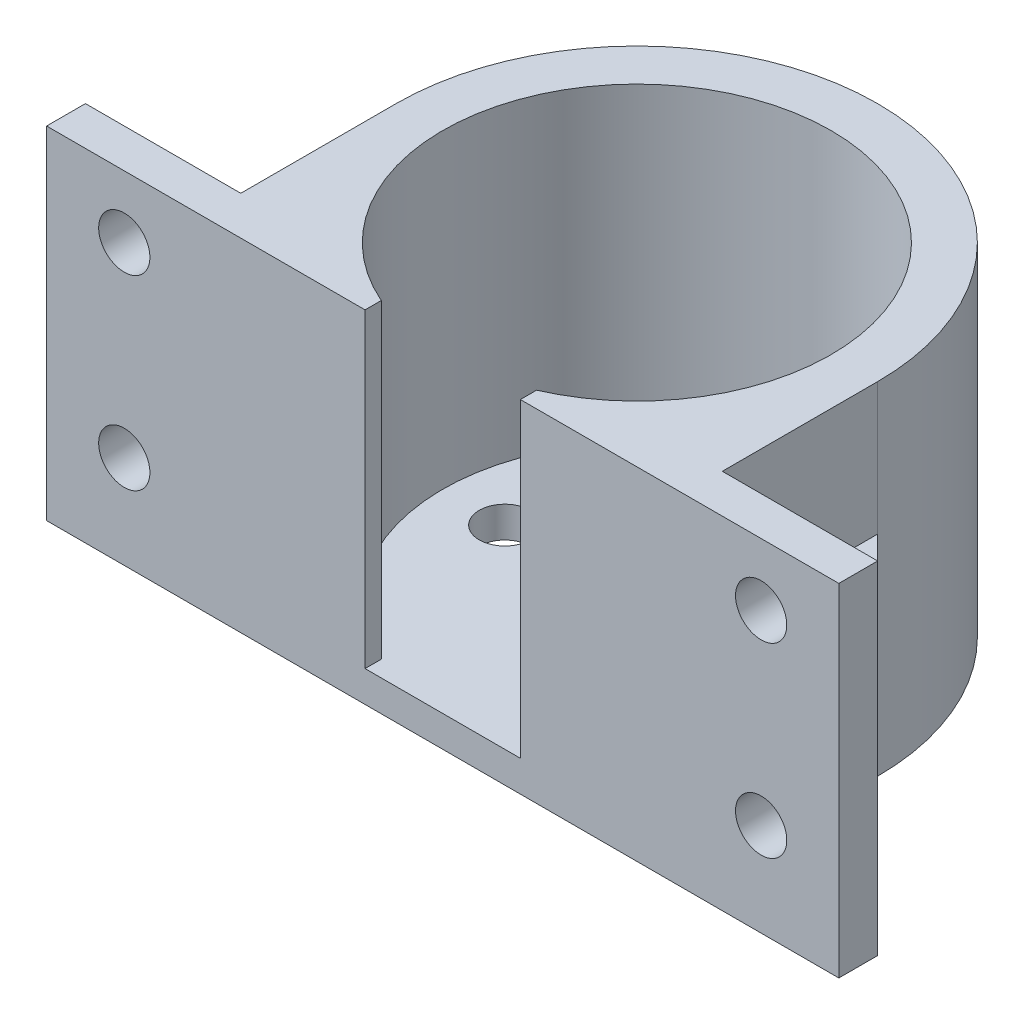
ISO-10303-21;
HEADER;
FILE_DESCRIPTION(('STEP AP214'),'2;1');
FILE_NAME('part.step','',(''),(''),'','','');
FILE_SCHEMA(('AUTOMOTIVE_DESIGN { 1 0 10303 214 1 1 1 1 }'));
ENDSEC;
DATA;
#1=APPLICATION_CONTEXT('core data for automotive mechanical design processes');
#2=APPLICATION_PROTOCOL_DEFINITION('international standard','automotive_design',2000,#1);
#3=PRODUCT_CONTEXT('',#1,'mechanical');
#4=PRODUCT('Part','Part','',(#3));
#5=PRODUCT_RELATED_PRODUCT_CATEGORY('part','',(#4));
#6=PRODUCT_DEFINITION_FORMATION('','',#4);
#7=PRODUCT_DEFINITION_CONTEXT('part definition',#1,'design');
#8=PRODUCT_DEFINITION('design','',#6,#7);
#9=PRODUCT_DEFINITION_SHAPE('','',#8);
#10=(LENGTH_UNIT() NAMED_UNIT(*) SI_UNIT(.MILLI.,.METRE.));
#11=(NAMED_UNIT(*) PLANE_ANGLE_UNIT() SI_UNIT($,.RADIAN.));
#12=(NAMED_UNIT(*) SI_UNIT($,.STERADIAN.) SOLID_ANGLE_UNIT());
#13=UNCERTAINTY_MEASURE_WITH_UNIT(LENGTH_MEASURE(1.E-05),#10,'distance_accuracy_value','');
#14=(GEOMETRIC_REPRESENTATION_CONTEXT(3) GLOBAL_UNCERTAINTY_ASSIGNED_CONTEXT((#13)) GLOBAL_UNIT_ASSIGNED_CONTEXT((#10,
#11,#12)) REPRESENTATION_CONTEXT('',''));
#15=CARTESIAN_POINT('',(0.,0.,0.));
#16=DIRECTION('',(0.,0.,1.));
#17=DIRECTION('',(1.,0.,0.));
#18=AXIS2_PLACEMENT_3D('',#15,#16,#17);
#19=CARTESIAN_POINT('',(-15.5,20.,0.));
#20=DIRECTION('',(1.,0.,0.));
#21=DIRECTION('',(0.,0.,-1.));
#22=AXIS2_PLACEMENT_3D('',#19,#20,#21);
#23=PLANE('',#22);
#24=DIRECTION('',(0.,0.,1.));
#25=VECTOR('',#24,1.);
#26=CARTESIAN_POINT('',(-15.5,8.5,0.));
#27=LINE('',#26,#25);
#28=CARTESIAN_POINT('',(-15.5,8.5,0.));
#29=VERTEX_POINT('',#28);
#30=CARTESIAN_POINT('',(-15.5,8.5,10.));
#31=VERTEX_POINT('',#30);
#32=EDGE_CURVE('E251',#29,#31,#27,.T.);
#33=ORIENTED_EDGE('',*,*,#32,.F.);
#34=DIRECTION('',(0.,-1.,0.));
#35=VECTOR('',#34,1.);
#36=CARTESIAN_POINT('',(-15.5,20.,0.));
#37=LINE('',#36,#35);
#38=CARTESIAN_POINT('',(-15.5,-2.,0.));
#39=VERTEX_POINT('',#38);
#40=EDGE_CURVE('E336',#29,#39,#37,.T.);
#41=ORIENTED_EDGE('',*,*,#40,.T.);
#42=DIRECTION('',(0.,0.,1.));
#43=VECTOR('',#42,1.);
#44=CARTESIAN_POINT('',(-15.5,-2.,0.));
#45=LINE('',#44,#43);
#46=CARTESIAN_POINT('',(-15.5,-2.,10.));
#47=VERTEX_POINT('',#46);
#48=EDGE_CURVE('E205',#39,#47,#45,.T.);
#49=ORIENTED_EDGE('',*,*,#48,.T.);
#50=DIRECTION('',(0.,-1.,0.));
#51=VECTOR('',#50,1.);
#52=CARTESIAN_POINT('',(-15.5,20.,10.));
#53=LINE('',#52,#51);
#54=EDGE_CURVE('E332',#31,#47,#53,.T.);
#55=ORIENTED_EDGE('',*,*,#54,.F.);
#56=EDGE_LOOP('',(#33,#41,#49,#55));
#57=FACE_BOUND('',#56,.T.);
#58=ADVANCED_FACE('F35',(#57),#23,.F.);
#59=CARTESIAN_POINT('',(0.,20.,10.));
#60=DIRECTION('',(0.,0.,1.));
#61=DIRECTION('',(1.,0.,0.));
#62=AXIS2_PLACEMENT_3D('',#59,#60,#61);
#63=PLANE('',#62);
#64=CARTESIAN_POINT('',(-20.5,4.,10.));
#65=DIRECTION('',(0.,0.,1.));
#66=DIRECTION('',(1.,0.,0.));
#67=AXIS2_PLACEMENT_3D('',#64,#65,#66);
#68=CIRCLE('',#67,1.65);
#69=CARTESIAN_POINT('',(-18.85,4.,10.));
#70=VERTEX_POINT('',#69);
#71=EDGE_CURVE('E231',#70,#70,#68,.T.);
#72=ORIENTED_EDGE('',*,*,#71,.T.);
#73=EDGE_LOOP('',(#72));
#74=FACE_BOUND('',#73,.T.);
#75=DIRECTION('',(-1.,0.,0.));
#76=VECTOR('',#75,1.);
#77=CARTESIAN_POINT('',(0.,8.5,10.));
#78=LINE('',#77,#76);
#79=CARTESIAN_POINT('',(-25.5,8.5,10.));
#80=VERTEX_POINT('',#79);
#81=EDGE_CURVE('E248',#31,#80,#78,.T.);
#82=ORIENTED_EDGE('',*,*,#81,.F.);
#83=ORIENTED_EDGE('',*,*,#54,.T.);
#84=DIRECTION('',(-1.,0.,0.));
#85=VECTOR('',#84,1.);
#86=CARTESIAN_POINT('',(0.,-2.,10.));
#87=LINE('',#86,#85);
#88=CARTESIAN_POINT('',(-25.5,-2.,10.));
#89=VERTEX_POINT('',#88);
#90=EDGE_CURVE('E208',#47,#89,#87,.T.);
#91=ORIENTED_EDGE('',*,*,#90,.T.);
#92=DIRECTION('',(0.,-1.,0.));
#93=VECTOR('',#92,1.);
#94=CARTESIAN_POINT('',(-25.5,20.,10.));
#95=LINE('',#94,#93);
#96=EDGE_CURVE('E328',#80,#89,#95,.T.);
#97=ORIENTED_EDGE('',*,*,#96,.F.);
#98=EDGE_LOOP('',(#82,#83,#91,#97));
#99=FACE_BOUND('',#98,.T.);
#100=ADVANCED_FACE('F360',(#74,#99),#63,.F.);
#101=CARTESIAN_POINT('',(15.5,20.,0.));
#102=DIRECTION('',(1.,0.,0.));
#103=DIRECTION('',(0.,0.,-1.));
#104=AXIS2_PLACEMENT_3D('',#101,#102,#103);
#105=PLANE('',#104);
#106=DIRECTION('',(0.,-1.,0.));
#107=VECTOR('',#106,1.);
#108=CARTESIAN_POINT('',(15.5,20.,0.));
#109=LINE('',#108,#107);
#110=CARTESIAN_POINT('',(15.5,8.5,0.));
#111=VERTEX_POINT('',#110);
#112=CARTESIAN_POINT('',(15.5,-2.,0.));
#113=VERTEX_POINT('',#112);
#114=EDGE_CURVE('E60',#111,#113,#109,.T.);
#115=ORIENTED_EDGE('',*,*,#114,.F.);
#116=DIRECTION('',(0.,0.,1.));
#117=VECTOR('',#116,1.);
#118=CARTESIAN_POINT('',(15.5,8.5,0.));
#119=LINE('',#118,#117);
#120=CARTESIAN_POINT('',(15.5,8.5,10.));
#121=VERTEX_POINT('',#120);
#122=EDGE_CURVE('E268',#111,#121,#119,.T.);
#123=ORIENTED_EDGE('',*,*,#122,.T.);
#124=DIRECTION('',(0.,-1.,0.));
#125=VECTOR('',#124,1.);
#126=CARTESIAN_POINT('',(15.5,20.,10.));
#127=LINE('',#126,#125);
#128=CARTESIAN_POINT('',(15.5,-2.,10.));
#129=VERTEX_POINT('',#128);
#130=EDGE_CURVE('E305',#121,#129,#127,.T.);
#131=ORIENTED_EDGE('',*,*,#130,.T.);
#132=DIRECTION('',(0.,0.,1.));
#133=VECTOR('',#132,1.);
#134=CARTESIAN_POINT('',(15.5,-2.,0.));
#135=LINE('',#134,#133);
#136=EDGE_CURVE('E200',#113,#129,#135,.T.);
#137=ORIENTED_EDGE('',*,*,#136,.F.);
#138=EDGE_LOOP('',(#115,#123,#131,#137));
#139=FACE_BOUND('',#138,.T.);
#140=ADVANCED_FACE('F363',(#139),#105,.T.);
#141=CARTESIAN_POINT('',(0.,20.,10.));
#142=DIRECTION('',(0.,0.,1.));
#143=DIRECTION('',(1.,0.,0.));
#144=AXIS2_PLACEMENT_3D('',#141,#142,#143);
#145=PLANE('',#144);
#146=CARTESIAN_POINT('',(20.5,4.,10.));
#147=DIRECTION('',(0.,0.,1.));
#148=DIRECTION('',(1.,0.,0.));
#149=AXIS2_PLACEMENT_3D('',#146,#147,#148);
#150=CIRCLE('',#149,1.65);
#151=CARTESIAN_POINT('',(22.15,4.,10.));
#152=VERTEX_POINT('',#151);
#153=EDGE_CURVE('E242',#152,#152,#150,.F.);
#154=ORIENTED_EDGE('',*,*,#153,.F.);
#155=EDGE_LOOP('',(#154));
#156=FACE_BOUND('',#155,.T.);
#157=DIRECTION('',(-1.,0.,0.));
#158=VECTOR('',#157,1.);
#159=CARTESIAN_POINT('',(0.,8.5,10.));
#160=LINE('',#159,#158);
#161=CARTESIAN_POINT('',(25.5,8.5,10.));
#162=VERTEX_POINT('',#161);
#163=EDGE_CURVE('E44',#162,#121,#160,.T.);
#164=ORIENTED_EDGE('',*,*,#163,.F.);
#165=DIRECTION('',(0.,-1.,0.));
#166=VECTOR('',#165,1.);
#167=CARTESIAN_POINT('',(25.5,20.,10.));
#168=LINE('',#167,#166);
#169=CARTESIAN_POINT('',(25.5,-2.,10.));
#170=VERTEX_POINT('',#169);
#171=EDGE_CURVE('E316',#162,#170,#168,.T.);
#172=ORIENTED_EDGE('',*,*,#171,.T.);
#173=DIRECTION('',(-1.,0.,0.));
#174=VECTOR('',#173,1.);
#175=CARTESIAN_POINT('',(0.,-2.,10.));
#176=LINE('',#175,#174);
#177=EDGE_CURVE('E186',#170,#129,#176,.T.);
#178=ORIENTED_EDGE('',*,*,#177,.T.);
#179=ORIENTED_EDGE('',*,*,#130,.F.);
#180=EDGE_LOOP('',(#164,#172,#178,#179));
#181=FACE_BOUND('',#180,.T.);
#182=ADVANCED_FACE('F382',(#156,#181),#145,.F.);
#183=DIRECTION('',(0.,0.,1.));
#184=VECTOR('',#183,1.);
#185=CARTESIAN_POINT('',(15.5,11.5,0.));
#186=LINE('',#185,#184);
#187=CARTESIAN_POINT('',(15.5,11.5,0.));
#188=VERTEX_POINT('',#187);
#189=CARTESIAN_POINT('',(15.5,11.5,10.));
#190=VERTEX_POINT('',#189);
#191=EDGE_CURVE('E272',#188,#190,#186,.T.);
#192=ORIENTED_EDGE('',*,*,#191,.F.);
#193=CARTESIAN_POINT('',(15.5,20.,0.));
#194=VERTEX_POINT('',#193);
#195=EDGE_CURVE('E340',#194,#188,#109,.T.);
#196=ORIENTED_EDGE('',*,*,#195,.F.);
#197=DIRECTION('',(0.,0.,1.));
#198=VECTOR('',#197,1.);
#199=CARTESIAN_POINT('',(15.5,20.,0.));
#200=LINE('',#199,#198);
#201=CARTESIAN_POINT('',(15.5,20.,10.));
#202=VERTEX_POINT('',#201);
#203=EDGE_CURVE('E278',#194,#202,#200,.T.);
#204=ORIENTED_EDGE('',*,*,#203,.T.);
#205=EDGE_CURVE('E313',#202,#190,#127,.T.);
#206=ORIENTED_EDGE('',*,*,#205,.T.);
#207=EDGE_LOOP('',(#192,#196,#204,#206));
#208=FACE_BOUND('',#207,.T.);
#209=ADVANCED_FACE('F37',(#208),#105,.T.);
#210=CARTESIAN_POINT('',(0.,20.,0.));
#211=DIRECTION('',(0.,-1.,0.));
#212=DIRECTION('',(0.,0.,-1.));
#213=AXIS2_PLACEMENT_3D('',#210,#211,#212);
#214=CYLINDRICAL_SURFACE('',#213,15.5);
#215=ORIENTED_EDGE('',*,*,#195,.T.);
#216=DIRECTION('',(0.,-1.,0.));
#217=VECTOR('',#216,1.);
#218=CARTESIAN_POINT('',(15.5,20.,0.));
#219=LINE('',#218,#217);
#220=EDGE_CURVE('E275',#188,#111,#219,.T.);
#221=ORIENTED_EDGE('',*,*,#220,.T.);
#222=ORIENTED_EDGE('',*,*,#114,.T.);
#223=CARTESIAN_POINT('',(0.,-2.,0.));
#224=DIRECTION('',(0.,1.,0.));
#225=DIRECTION('',(0.,0.,1.));
#226=AXIS2_PLACEMENT_3D('',#223,#224,#225);
#227=CIRCLE('',#226,15.5);
#228=EDGE_CURVE('E202',#113,#39,#227,.T.);
#229=ORIENTED_EDGE('',*,*,#228,.T.);
#230=ORIENTED_EDGE('',*,*,#40,.F.);
#231=DIRECTION('',(0.,1.,0.));
#232=VECTOR('',#231,1.);
#233=CARTESIAN_POINT('',(-15.5,20.,0.));
#234=LINE('',#233,#232);
#235=CARTESIAN_POINT('',(-15.5,11.5,0.));
#236=VERTEX_POINT('',#235);
#237=EDGE_CURVE('E261',#29,#236,#234,.T.);
#238=ORIENTED_EDGE('',*,*,#237,.T.);
#239=CARTESIAN_POINT('',(-15.5,20.,0.));
#240=VERTEX_POINT('',#239);
#241=EDGE_CURVE('E337',#240,#236,#37,.T.);
#242=ORIENTED_EDGE('',*,*,#241,.F.);
#243=CARTESIAN_POINT('',(0.,20.,0.));
#244=DIRECTION('',(0.,1.,0.));
#245=DIRECTION('',(0.,0.,1.));
#246=AXIS2_PLACEMENT_3D('',#243,#244,#245);
#247=CIRCLE('',#246,15.5);
#248=EDGE_CURVE('E281',#194,#240,#247,.T.);
#249=ORIENTED_EDGE('',*,*,#248,.F.);
#250=EDGE_LOOP('',(#215,#221,#222,#229,#230,#238,#242,#249));
#251=FACE_BOUND('',#250,.T.);
#252=ADVANCED_FACE('F378',(#251),#214,.T.);
#253=ORIENTED_EDGE('',*,*,#241,.T.);
#254=DIRECTION('',(0.,0.,1.));
#255=VECTOR('',#254,1.);
#256=CARTESIAN_POINT('',(-15.5,11.5,0.));
#257=LINE('',#256,#255);
#258=CARTESIAN_POINT('',(-15.5,11.5,10.));
#259=VERTEX_POINT('',#258);
#260=EDGE_CURVE('E256',#236,#259,#257,.T.);
#261=ORIENTED_EDGE('',*,*,#260,.T.);
#262=CARTESIAN_POINT('',(-15.5,20.,10.));
#263=VERTEX_POINT('',#262);
#264=EDGE_CURVE('E333',#263,#259,#53,.T.);
#265=ORIENTED_EDGE('',*,*,#264,.F.);
#266=DIRECTION('',(0.,0.,1.));
#267=VECTOR('',#266,1.);
#268=CARTESIAN_POINT('',(-15.5,20.,0.));
#269=LINE('',#268,#267);
#270=EDGE_CURVE('E284',#240,#263,#269,.T.);
#271=ORIENTED_EDGE('',*,*,#270,.F.);
#272=EDGE_LOOP('',(#253,#261,#265,#271));
#273=FACE_BOUND('',#272,.T.);
#274=ADVANCED_FACE('F405',(#273),#23,.F.);
#275=CARTESIAN_POINT('',(-20.5,16.,10.));
#276=DIRECTION('',(0.,0.,1.));
#277=DIRECTION('',(1.,0.,0.));
#278=AXIS2_PLACEMENT_3D('',#275,#276,#277);
#279=CIRCLE('',#278,1.65);
#280=CARTESIAN_POINT('',(-18.85,16.,10.));
#281=VERTEX_POINT('',#280);
#282=EDGE_CURVE('E234',#281,#281,#279,.T.);
#283=ORIENTED_EDGE('',*,*,#282,.T.);
#284=EDGE_LOOP('',(#283));
#285=FACE_BOUND('',#284,.T.);
#286=ORIENTED_EDGE('',*,*,#264,.T.);
#287=DIRECTION('',(-1.,0.,0.));
#288=VECTOR('',#287,1.);
#289=CARTESIAN_POINT('',(0.,11.5,10.));
#290=LINE('',#289,#288);
#291=CARTESIAN_POINT('',(-25.5,11.5,10.));
#292=VERTEX_POINT('',#291);
#293=EDGE_CURVE('E253',#259,#292,#290,.T.);
#294=ORIENTED_EDGE('',*,*,#293,.T.);
#295=CARTESIAN_POINT('',(-25.5,20.,10.));
#296=VERTEX_POINT('',#295);
#297=EDGE_CURVE('E329',#296,#292,#95,.T.);
#298=ORIENTED_EDGE('',*,*,#297,.F.);
#299=DIRECTION('',(-1.,0.,0.));
#300=VECTOR('',#299,1.);
#301=CARTESIAN_POINT('',(0.,20.,10.));
#302=LINE('',#301,#300);
#303=EDGE_CURVE('E286',#263,#296,#302,.T.);
#304=ORIENTED_EDGE('',*,*,#303,.F.);
#305=EDGE_LOOP('',(#286,#294,#298,#304));
#306=FACE_BOUND('',#305,.T.);
#307=ADVANCED_FACE('F365',(#285,#306),#63,.F.);
#308=CARTESIAN_POINT('',(-25.5,20.,0.));
#309=DIRECTION('',(1.,0.,0.));
#310=DIRECTION('',(0.,0.,-1.));
#311=AXIS2_PLACEMENT_3D('',#308,#309,#310);
#312=PLANE('',#311);
#313=ORIENTED_EDGE('',*,*,#297,.T.);
#314=DIRECTION('',(0.,1.,0.));
#315=VECTOR('',#314,1.);
#316=CARTESIAN_POINT('',(-25.5,20.,10.));
#317=LINE('',#316,#315);
#318=EDGE_CURVE('E259',#80,#292,#317,.T.);
#319=ORIENTED_EDGE('',*,*,#318,.F.);
#320=ORIENTED_EDGE('',*,*,#96,.T.);
#321=DIRECTION('',(0.,0.,1.));
#322=VECTOR('',#321,1.);
#323=CARTESIAN_POINT('',(-25.5,-2.,0.));
#324=LINE('',#323,#322);
#325=CARTESIAN_POINT('',(-25.5,-2.,12.5));
#326=VERTEX_POINT('',#325);
#327=EDGE_CURVE('E211',#89,#326,#324,.T.);
#328=ORIENTED_EDGE('',*,*,#327,.T.);
#329=DIRECTION('',(0.,-1.,0.));
#330=VECTOR('',#329,1.);
#331=CARTESIAN_POINT('',(-25.5,20.,12.5));
#332=LINE('',#331,#330);
#333=CARTESIAN_POINT('',(-25.5,20.,12.5));
#334=VERTEX_POINT('',#333);
#335=EDGE_CURVE('E192',#334,#326,#332,.T.);
#336=ORIENTED_EDGE('',*,*,#335,.F.);
#337=DIRECTION('',(0.,0.,1.));
#338=VECTOR('',#337,1.);
#339=CARTESIAN_POINT('',(-25.5,20.,0.));
#340=LINE('',#339,#338);
#341=EDGE_CURVE('E288',#296,#334,#340,.T.);
#342=ORIENTED_EDGE('',*,*,#341,.F.);
#343=EDGE_LOOP('',(#313,#319,#320,#328,#336,#342));
#344=FACE_BOUND('',#343,.T.);
#345=ADVANCED_FACE('F414',(#344),#312,.F.);
#346=CARTESIAN_POINT('',(-5.,20.,0.));
#347=DIRECTION('',(1.,0.,0.));
#348=DIRECTION('',(0.,0.,-1.));
#349=AXIS2_PLACEMENT_3D('',#346,#347,#348);
#350=PLANE('',#349);
#351=DIRECTION('',(0.,-1.,0.));
#352=VECTOR('',#351,1.);
#353=CARTESIAN_POINT('',(-5.,20.,12.5));
#354=LINE('',#353,#352);
#355=CARTESIAN_POINT('',(-5.,20.,12.5));
#356=VERTEX_POINT('',#355);
#357=CARTESIAN_POINT('',(-5.,0.,12.5));
#358=VERTEX_POINT('',#357);
#359=EDGE_CURVE('E325',#356,#358,#354,.T.);
#360=ORIENTED_EDGE('',*,*,#359,.T.);
#361=DIRECTION('',(0.,0.,1.));
#362=VECTOR('',#361,1.);
#363=CARTESIAN_POINT('',(-5.,0.,0.));
#364=LINE('',#363,#362);
#365=CARTESIAN_POINT('',(-5.,0.,11.4564392373896));
#366=VERTEX_POINT('',#365);
#367=EDGE_CURVE('E277',#366,#358,#364,.T.);
#368=ORIENTED_EDGE('',*,*,#367,.F.);
#369=DIRECTION('',(0.,-1.,0.));
#370=VECTOR('',#369,1.);
#371=CARTESIAN_POINT('',(-5.,20.,11.4564392373896));
#372=LINE('',#371,#370);
#373=CARTESIAN_POINT('',(-5.,20.,11.4564392373896));
#374=VERTEX_POINT('',#373);
#375=EDGE_CURVE('E323',#374,#366,#372,.T.);
#376=ORIENTED_EDGE('',*,*,#375,.F.);
#377=DIRECTION('',(0.,0.,1.));
#378=VECTOR('',#377,1.);
#379=CARTESIAN_POINT('',(-5.,20.,0.));
#380=LINE('',#379,#378);
#381=EDGE_CURVE('E292',#374,#356,#380,.T.);
#382=ORIENTED_EDGE('',*,*,#381,.T.);
#383=EDGE_LOOP('',(#360,#368,#376,#382));
#384=FACE_BOUND('',#383,.T.);
#385=ADVANCED_FACE('F631',(#384),#350,.T.);
#386=CARTESIAN_POINT('',(0.,20.,0.));
#387=DIRECTION('',(0.,-1.,0.));
#388=DIRECTION('',(0.,0.,-1.));
#389=AXIS2_PLACEMENT_3D('',#386,#387,#388);
#390=CYLINDRICAL_SURFACE('',#389,12.5);
#391=ORIENTED_EDGE('',*,*,#375,.T.);
#392=CARTESIAN_POINT('',(0.,0.,0.));
#393=DIRECTION('',(0.,1.,0.));
#394=DIRECTION('',(0.,0.,1.));
#395=AXIS2_PLACEMENT_3D('',#392,#393,#394);
#396=CIRCLE('',#395,12.5);
#397=CARTESIAN_POINT('',(5.,0.,11.4564392373896));
#398=VERTEX_POINT('',#397);
#399=EDGE_CURVE('E308',#398,#366,#396,.T.);
#400=ORIENTED_EDGE('',*,*,#399,.F.);
#401=DIRECTION('',(0.,-1.,0.));
#402=VECTOR('',#401,1.);
#403=CARTESIAN_POINT('',(5.,20.,11.4564392373896));
#404=LINE('',#403,#402);
#405=CARTESIAN_POINT('',(5.,20.,11.4564392373896));
#406=VERTEX_POINT('',#405);
#407=EDGE_CURVE('E321',#406,#398,#404,.T.);
#408=ORIENTED_EDGE('',*,*,#407,.F.);
#409=CARTESIAN_POINT('',(0.,20.,0.));
#410=DIRECTION('',(0.,1.,0.));
#411=DIRECTION('',(0.,0.,1.));
#412=AXIS2_PLACEMENT_3D('',#409,#410,#411);
#413=CIRCLE('',#412,12.5);
#414=EDGE_CURVE('E295',#406,#374,#413,.T.);
#415=ORIENTED_EDGE('',*,*,#414,.T.);
#416=EDGE_LOOP('',(#391,#400,#408,#415));
#417=FACE_BOUND('',#416,.T.);
#418=ADVANCED_FACE('F654',(#417),#390,.F.);
#419=CARTESIAN_POINT('',(5.,20.,0.));
#420=DIRECTION('',(1.,0.,0.));
#421=DIRECTION('',(0.,0.,-1.));
#422=AXIS2_PLACEMENT_3D('',#419,#420,#421);
#423=PLANE('',#422);
#424=ORIENTED_EDGE('',*,*,#407,.T.);
#425=DIRECTION('',(0.,0.,1.));
#426=VECTOR('',#425,1.);
#427=CARTESIAN_POINT('',(5.,0.,0.));
#428=LINE('',#427,#426);
#429=CARTESIAN_POINT('',(5.,0.,12.5));
#430=VERTEX_POINT('',#429);
#431=EDGE_CURVE('E282',#398,#430,#428,.T.);
#432=ORIENTED_EDGE('',*,*,#431,.T.);
#433=DIRECTION('',(0.,-1.,0.));
#434=VECTOR('',#433,1.);
#435=CARTESIAN_POINT('',(5.,20.,12.5));
#436=LINE('',#435,#434);
#437=CARTESIAN_POINT('',(5.,20.,12.5));
#438=VERTEX_POINT('',#437);
#439=EDGE_CURVE('E173',#438,#430,#436,.T.);
#440=ORIENTED_EDGE('',*,*,#439,.F.);
#441=DIRECTION('',(0.,0.,1.));
#442=VECTOR('',#441,1.);
#443=CARTESIAN_POINT('',(5.,20.,0.));
#444=LINE('',#443,#442);
#445=EDGE_CURVE('E298',#406,#438,#444,.T.);
#446=ORIENTED_EDGE('',*,*,#445,.F.);
#447=EDGE_LOOP('',(#424,#432,#440,#446));
#448=FACE_BOUND('',#447,.T.);
#449=ADVANCED_FACE('F607',(#448),#423,.F.);
#450=CARTESIAN_POINT('',(0.,20.,12.5));
#451=DIRECTION('',(0.,0.,-1.));
#452=DIRECTION('',(-1.,0.,0.));
#453=AXIS2_PLACEMENT_3D('',#450,#451,#452);
#454=PLANE('',#453);
#455=CARTESIAN_POINT('',(20.5,16.,12.5));
#456=DIRECTION('',(0.,0.,-1.));
#457=DIRECTION('',(-1.,0.,0.));
#458=AXIS2_PLACEMENT_3D('',#455,#456,#457);
#459=CIRCLE('',#458,1.65);
#460=CARTESIAN_POINT('',(18.85,16.,12.5));
#461=VERTEX_POINT('',#460);
#462=EDGE_CURVE('E238',#461,#461,#459,.F.);
#463=ORIENTED_EDGE('',*,*,#462,.F.);
#464=EDGE_LOOP('',(#463));
#465=FACE_BOUND('',#464,.T.);
#466=CARTESIAN_POINT('',(20.5,4.,12.5));
#467=DIRECTION('',(0.,0.,-1.));
#468=DIRECTION('',(-1.,0.,0.));
#469=AXIS2_PLACEMENT_3D('',#466,#467,#468);
#470=CIRCLE('',#469,1.65);
#471=CARTESIAN_POINT('',(18.85,4.,12.5));
#472=VERTEX_POINT('',#471);
#473=EDGE_CURVE('E241',#472,#472,#470,.F.);
#474=ORIENTED_EDGE('',*,*,#473,.F.);
#475=EDGE_LOOP('',(#474));
#476=FACE_BOUND('',#475,.T.);
#477=ORIENTED_EDGE('',*,*,#439,.T.);
#478=DIRECTION('',(1.,0.,0.));
#479=VECTOR('',#478,1.);
#480=CARTESIAN_POINT('',(0.,0.,12.5));
#481=LINE('',#480,#479);
#482=EDGE_CURVE('E223',#358,#430,#481,.T.);
#483=ORIENTED_EDGE('',*,*,#482,.F.);
#484=ORIENTED_EDGE('',*,*,#359,.F.);
#485=DIRECTION('',(1.,0.,0.));
#486=VECTOR('',#485,1.);
#487=CARTESIAN_POINT('',(0.,20.,12.5));
#488=LINE('',#487,#486);
#489=EDGE_CURVE('E290',#334,#356,#488,.T.);
#490=ORIENTED_EDGE('',*,*,#489,.F.);
#491=ORIENTED_EDGE('',*,*,#335,.T.);
#492=DIRECTION('',(1.,0.,0.));
#493=VECTOR('',#492,1.);
#494=CARTESIAN_POINT('',(0.,-2.,12.5));
#495=LINE('',#494,#493);
#496=CARTESIAN_POINT('',(25.5,-2.,12.5));
#497=VERTEX_POINT('',#496);
#498=EDGE_CURVE('E182',#326,#497,#495,.T.);
#499=ORIENTED_EDGE('',*,*,#498,.T.);
#500=DIRECTION('',(0.,-1.,0.));
#501=VECTOR('',#500,1.);
#502=CARTESIAN_POINT('',(25.5,20.,12.5));
#503=LINE('',#502,#501);
#504=CARTESIAN_POINT('',(25.5,20.,12.5));
#505=VERTEX_POINT('',#504);
#506=EDGE_CURVE('E163',#505,#497,#503,.T.);
#507=ORIENTED_EDGE('',*,*,#506,.F.);
#508=DIRECTION('',(1.,0.,0.));
#509=VECTOR('',#508,1.);
#510=CARTESIAN_POINT('',(0.,20.,12.5));
#511=LINE('',#510,#509);
#512=EDGE_CURVE('E300',#438,#505,#511,.T.);
#513=ORIENTED_EDGE('',*,*,#512,.F.);
#514=EDGE_LOOP('',(#477,#483,#484,#490,#491,#499,#507,#513));
#515=FACE_BOUND('',#514,.T.);
#516=CARTESIAN_POINT('',(-20.5,16.,12.5));
#517=DIRECTION('',(0.,0.,-1.));
#518=DIRECTION('',(-1.,0.,0.));
#519=AXIS2_PLACEMENT_3D('',#516,#517,#518);
#520=CIRCLE('',#519,1.65);
#521=CARTESIAN_POINT('',(-22.15,16.,12.5));
#522=VERTEX_POINT('',#521);
#523=EDGE_CURVE('E39',#522,#522,#520,.T.);
#524=ORIENTED_EDGE('',*,*,#523,.T.);
#525=EDGE_LOOP('',(#524));
#526=FACE_BOUND('',#525,.T.);
#527=CARTESIAN_POINT('',(-20.5,4.,12.5));
#528=DIRECTION('',(0.,0.,-1.));
#529=DIRECTION('',(-1.,0.,0.));
#530=AXIS2_PLACEMENT_3D('',#527,#528,#529);
#531=CIRCLE('',#530,1.65);
#532=CARTESIAN_POINT('',(-22.15,4.,12.5));
#533=VERTEX_POINT('',#532);
#534=EDGE_CURVE('E222',#533,#533,#531,.T.);
#535=ORIENTED_EDGE('',*,*,#534,.T.);
#536=EDGE_LOOP('',(#535));
#537=FACE_BOUND('',#536,.T.);
#538=ADVANCED_FACE('F188',(#465,#476,#515,#526,#537),#454,.F.);
#539=CARTESIAN_POINT('',(25.5,20.,0.));
#540=DIRECTION('',(-1.,0.,0.));
#541=DIRECTION('',(0.,0.,1.));
#542=AXIS2_PLACEMENT_3D('',#539,#540,#541);
#543=PLANE('',#542);
#544=ORIENTED_EDGE('',*,*,#506,.T.);
#545=DIRECTION('',(0.,0.,-1.));
#546=VECTOR('',#545,1.);
#547=CARTESIAN_POINT('',(25.5,-2.,0.));
#548=LINE('',#547,#546);
#549=EDGE_CURVE('E167',#497,#170,#548,.T.);
#550=ORIENTED_EDGE('',*,*,#549,.T.);
#551=ORIENTED_EDGE('',*,*,#171,.F.);
#552=CARTESIAN_POINT('',(25.5,11.5,10.));
#553=VERTEX_POINT('',#552);
#554=EDGE_CURVE('E318',#553,#162,#168,.T.);
#555=ORIENTED_EDGE('',*,*,#554,.F.);
#556=CARTESIAN_POINT('',(25.5,20.,10.));
#557=VERTEX_POINT('',#556);
#558=EDGE_CURVE('E174',#557,#553,#168,.T.);
#559=ORIENTED_EDGE('',*,*,#558,.F.);
#560=DIRECTION('',(0.,0.,-1.));
#561=VECTOR('',#560,1.);
#562=CARTESIAN_POINT('',(25.5,20.,0.));
#563=LINE('',#562,#561);
#564=EDGE_CURVE('E169',#505,#557,#563,.T.);
#565=ORIENTED_EDGE('',*,*,#564,.F.);
#566=EDGE_LOOP('',(#544,#550,#551,#555,#559,#565));
#567=FACE_BOUND('',#566,.T.);
#568=ADVANCED_FACE('F165',(#567),#543,.F.);
#569=CARTESIAN_POINT('',(20.5,16.,10.));
#570=DIRECTION('',(0.,0.,1.));
#571=DIRECTION('',(1.,0.,0.));
#572=AXIS2_PLACEMENT_3D('',#569,#570,#571);
#573=CIRCLE('',#572,1.65);
#574=CARTESIAN_POINT('',(22.15,16.,10.));
#575=VERTEX_POINT('',#574);
#576=EDGE_CURVE('E237',#575,#575,#573,.F.);
#577=ORIENTED_EDGE('',*,*,#576,.F.);
#578=EDGE_LOOP('',(#577));
#579=FACE_BOUND('',#578,.T.);
#580=ORIENTED_EDGE('',*,*,#558,.T.);
#581=DIRECTION('',(-1.,0.,0.));
#582=VECTOR('',#581,1.);
#583=CARTESIAN_POINT('',(0.,11.5,10.));
#584=LINE('',#583,#582);
#585=EDGE_CURVE('E11',#553,#190,#584,.T.);
#586=ORIENTED_EDGE('',*,*,#585,.T.);
#587=ORIENTED_EDGE('',*,*,#205,.F.);
#588=DIRECTION('',(-1.,0.,0.));
#589=VECTOR('',#588,1.);
#590=CARTESIAN_POINT('',(0.,20.,10.));
#591=LINE('',#590,#589);
#592=EDGE_CURVE('E303',#557,#202,#591,.T.);
#593=ORIENTED_EDGE('',*,*,#592,.F.);
#594=EDGE_LOOP('',(#580,#586,#587,#593));
#595=FACE_BOUND('',#594,.T.);
#596=ADVANCED_FACE('F500',(#579,#595),#145,.F.);
#597=CARTESIAN_POINT('',(0.,20.,0.));
#598=DIRECTION('',(0.,1.,0.));
#599=DIRECTION('',(0.,0.,1.));
#600=AXIS2_PLACEMENT_3D('',#597,#598,#599);
#601=PLANE('',#600);
#602=ORIENTED_EDGE('',*,*,#203,.F.);
#603=ORIENTED_EDGE('',*,*,#248,.T.);
#604=ORIENTED_EDGE('',*,*,#270,.T.);
#605=ORIENTED_EDGE('',*,*,#303,.T.);
#606=ORIENTED_EDGE('',*,*,#341,.T.);
#607=ORIENTED_EDGE('',*,*,#489,.T.);
#608=ORIENTED_EDGE('',*,*,#381,.F.);
#609=ORIENTED_EDGE('',*,*,#414,.F.);
#610=ORIENTED_EDGE('',*,*,#445,.T.);
#611=ORIENTED_EDGE('',*,*,#512,.T.);
#612=ORIENTED_EDGE('',*,*,#564,.T.);
#613=ORIENTED_EDGE('',*,*,#592,.T.);
#614=EDGE_LOOP('',(#602,#603,#604,#605,#606,#607,#608,#609,#610,#611,#612,#613));
#615=FACE_BOUND('',#614,.T.);
#616=ADVANCED_FACE('F504',(#615),#601,.T.);
#617=CARTESIAN_POINT('',(15.5,10.,0.));
#618=DIRECTION('',(-0.707106781186548,0.,0.707106781186547));
#619=DIRECTION('',(0.707106781186548,0.,0.707106781186548));
#620=AXIS2_PLACEMENT_3D('',#617,#618,#619);
#621=PLANE('',#620);
#622=ORIENTED_EDGE('',*,*,#220,.F.);
#623=DIRECTION('',(0.707106781186548,0.,0.707106781186548));
#624=VECTOR('',#623,1.);
#625=CARTESIAN_POINT('',(15.5,11.5,0.));
#626=LINE('',#625,#624);
#627=EDGE_CURVE('E265',#188,#553,#626,.T.);
#628=ORIENTED_EDGE('',*,*,#627,.T.);
#629=ORIENTED_EDGE('',*,*,#554,.T.);
#630=DIRECTION('',(0.707106781186548,0.,0.707106781186548));
#631=VECTOR('',#630,1.);
#632=CARTESIAN_POINT('',(15.5,8.5,0.));
#633=LINE('',#632,#631);
#634=EDGE_CURVE('E264',#111,#162,#633,.T.);
#635=ORIENTED_EDGE('',*,*,#634,.F.);
#636=EDGE_LOOP('',(#622,#628,#629,#635));
#637=FACE_BOUND('',#636,.T.);
#638=ADVANCED_FACE('F386',(#637),#621,.F.);
#639=CARTESIAN_POINT('',(0.,11.5,-1.5));
#640=DIRECTION('',(0.,1.,0.));
#641=DIRECTION('',(0.,0.,1.));
#642=AXIS2_PLACEMENT_3D('',#639,#640,#641);
#643=PLANE('',#642);
#644=ORIENTED_EDGE('',*,*,#627,.F.);
#645=ORIENTED_EDGE('',*,*,#191,.T.);
#646=ORIENTED_EDGE('',*,*,#585,.F.);
#647=EDGE_LOOP('',(#644,#645,#646));
#648=FACE_BOUND('',#647,.T.);
#649=ADVANCED_FACE('F392',(#648),#643,.T.);
#650=CARTESIAN_POINT('',(0.,8.5,-1.5));
#651=DIRECTION('',(0.,1.,0.));
#652=DIRECTION('',(0.,0.,1.));
#653=AXIS2_PLACEMENT_3D('',#650,#651,#652);
#654=PLANE('',#653);
#655=ORIENTED_EDGE('',*,*,#122,.F.);
#656=ORIENTED_EDGE('',*,*,#634,.T.);
#657=ORIENTED_EDGE('',*,*,#163,.T.);
#658=EDGE_LOOP('',(#655,#656,#657));
#659=FACE_BOUND('',#658,.T.);
#660=ADVANCED_FACE('F389',(#659),#654,.F.);
#661=CARTESIAN_POINT('',(-15.5,10.,0.));
#662=DIRECTION('',(-0.707106781186548,0.,-0.707106781186547));
#663=DIRECTION('',(-0.707106781186548,0.,0.707106781186548));
#664=AXIS2_PLACEMENT_3D('',#661,#662,#663);
#665=PLANE('',#664);
#666=ORIENTED_EDGE('',*,*,#237,.F.);
#667=DIRECTION('',(-0.707106781186548,0.,0.707106781186548));
#668=VECTOR('',#667,1.);
#669=CARTESIAN_POINT('',(-15.5,8.5,0.));
#670=LINE('',#669,#668);
#671=EDGE_CURVE('E52',#29,#80,#670,.T.);
#672=ORIENTED_EDGE('',*,*,#671,.T.);
#673=ORIENTED_EDGE('',*,*,#318,.T.);
#674=DIRECTION('',(-0.707106781186548,0.,0.707106781186548));
#675=VECTOR('',#674,1.);
#676=CARTESIAN_POINT('',(-15.5,11.5,0.));
#677=LINE('',#676,#675);
#678=EDGE_CURVE('E245',#236,#292,#677,.T.);
#679=ORIENTED_EDGE('',*,*,#678,.F.);
#680=EDGE_LOOP('',(#666,#672,#673,#679));
#681=FACE_BOUND('',#680,.T.);
#682=ADVANCED_FACE('F391',(#681),#665,.T.);
#683=CARTESIAN_POINT('',(0.,11.5,-1.5));
#684=DIRECTION('',(0.,1.,0.));
#685=DIRECTION('',(0.,0.,1.));
#686=AXIS2_PLACEMENT_3D('',#683,#684,#685);
#687=PLANE('',#686);
#688=ORIENTED_EDGE('',*,*,#260,.F.);
#689=ORIENTED_EDGE('',*,*,#678,.T.);
#690=ORIENTED_EDGE('',*,*,#293,.F.);
#691=EDGE_LOOP('',(#688,#689,#690));
#692=FACE_BOUND('',#691,.T.);
#693=ADVANCED_FACE('F398',(#692),#687,.T.);
#694=CARTESIAN_POINT('',(0.,8.5,-1.5));
#695=DIRECTION('',(0.,1.,0.));
#696=DIRECTION('',(0.,0.,1.));
#697=AXIS2_PLACEMENT_3D('',#694,#695,#696);
#698=PLANE('',#697);
#699=ORIENTED_EDGE('',*,*,#671,.F.);
#700=ORIENTED_EDGE('',*,*,#32,.T.);
#701=ORIENTED_EDGE('',*,*,#81,.T.);
#702=EDGE_LOOP('',(#699,#700,#701));
#703=FACE_BOUND('',#702,.T.);
#704=ADVANCED_FACE('F422',(#703),#698,.F.);
#705=CARTESIAN_POINT('',(20.5,16.,18.));
#706=DIRECTION('',(0.,0.,-1.));
#707=DIRECTION('',(-1.,0.,0.));
#708=AXIS2_PLACEMENT_3D('',#705,#706,#707);
#709=CYLINDRICAL_SURFACE('',#708,1.65);
#710=ORIENTED_EDGE('',*,*,#576,.T.);
#711=EDGE_LOOP('',(#710));
#712=FACE_BOUND('',#711,.T.);
#713=ORIENTED_EDGE('',*,*,#462,.T.);
#714=EDGE_LOOP('',(#713));
#715=FACE_BOUND('',#714,.T.);
#716=ADVANCED_FACE('F424',(#712,#715),#709,.F.);
#717=CARTESIAN_POINT('',(20.5,4.,18.));
#718=DIRECTION('',(0.,0.,-1.));
#719=DIRECTION('',(-1.,0.,0.));
#720=AXIS2_PLACEMENT_3D('',#717,#718,#719);
#721=CYLINDRICAL_SURFACE('',#720,1.65);
#722=ORIENTED_EDGE('',*,*,#473,.T.);
#723=EDGE_LOOP('',(#722));
#724=FACE_BOUND('',#723,.T.);
#725=ORIENTED_EDGE('',*,*,#153,.T.);
#726=EDGE_LOOP('',(#725));
#727=FACE_BOUND('',#726,.T.);
#728=ADVANCED_FACE('F356',(#724,#727),#721,.F.);
#729=CARTESIAN_POINT('',(-20.5,4.,18.));
#730=DIRECTION('',(0.,0.,-1.));
#731=DIRECTION('',(-1.,0.,0.));
#732=AXIS2_PLACEMENT_3D('',#729,#730,#731);
#733=CYLINDRICAL_SURFACE('',#732,1.65);
#734=ORIENTED_EDGE('',*,*,#534,.F.);
#735=EDGE_LOOP('',(#734));
#736=FACE_BOUND('',#735,.T.);
#737=ORIENTED_EDGE('',*,*,#71,.F.);
#738=EDGE_LOOP('',(#737));
#739=FACE_BOUND('',#738,.T.);
#740=ADVANCED_FACE('F352',(#736,#739),#733,.F.);
#741=CARTESIAN_POINT('',(-20.5,16.,18.));
#742=DIRECTION('',(0.,0.,-1.));
#743=DIRECTION('',(-1.,0.,0.));
#744=AXIS2_PLACEMENT_3D('',#741,#742,#743);
#745=CYLINDRICAL_SURFACE('',#744,1.65);
#746=ORIENTED_EDGE('',*,*,#523,.F.);
#747=EDGE_LOOP('',(#746));
#748=FACE_BOUND('',#747,.T.);
#749=ORIENTED_EDGE('',*,*,#282,.F.);
#750=EDGE_LOOP('',(#749));
#751=FACE_BOUND('',#750,.T.);
#752=ADVANCED_FACE('F355',(#748,#751),#745,.F.);
#753=CARTESIAN_POINT('',(0.,0.,0.));
#754=DIRECTION('',(0.,1.,0.));
#755=DIRECTION('',(0.,0.,1.));
#756=AXIS2_PLACEMENT_3D('',#753,#754,#755);
#757=PLANE('',#756);
#758=CARTESIAN_POINT('',(-8.5,0.,0.));
#759=DIRECTION('',(0.,1.,0.));
#760=DIRECTION('',(0.,0.,1.));
#761=AXIS2_PLACEMENT_3D('',#758,#759,#760);
#762=CIRCLE('',#761,1.65);
#763=CARTESIAN_POINT('',(-8.5,0.,1.65));
#764=VERTEX_POINT('',#763);
#765=EDGE_CURVE('E193',#764,#764,#762,.T.);
#766=ORIENTED_EDGE('',*,*,#765,.F.);
#767=EDGE_LOOP('',(#766));
#768=FACE_BOUND('',#767,.T.);
#769=CARTESIAN_POINT('',(8.5,0.,0.));
#770=DIRECTION('',(0.,1.,0.));
#771=DIRECTION('',(0.,0.,1.));
#772=AXIS2_PLACEMENT_3D('',#769,#770,#771);
#773=CIRCLE('',#772,1.65);
#774=CARTESIAN_POINT('',(8.5,0.,1.65));
#775=VERTEX_POINT('',#774);
#776=EDGE_CURVE('E196',#775,#775,#773,.T.);
#777=ORIENTED_EDGE('',*,*,#776,.F.);
#778=EDGE_LOOP('',(#777));
#779=FACE_BOUND('',#778,.T.);
#780=CARTESIAN_POINT('',(0.,0.,0.));
#781=DIRECTION('',(0.,1.,0.));
#782=DIRECTION('',(0.,0.,1.));
#783=AXIS2_PLACEMENT_3D('',#780,#781,#782);
#784=CIRCLE('',#783,4.5);
#785=CARTESIAN_POINT('',(0.,0.,4.5));
#786=VERTEX_POINT('',#785);
#787=EDGE_CURVE('E226',#786,#786,#784,.T.);
#788=ORIENTED_EDGE('',*,*,#787,.F.);
#789=EDGE_LOOP('',(#788));
#790=FACE_BOUND('',#789,.T.);
#791=ORIENTED_EDGE('',*,*,#431,.F.);
#792=ORIENTED_EDGE('',*,*,#399,.T.);
#793=ORIENTED_EDGE('',*,*,#367,.T.);
#794=ORIENTED_EDGE('',*,*,#482,.T.);
#795=EDGE_LOOP('',(#791,#792,#793,#794));
#796=FACE_BOUND('',#795,.T.);
#797=ADVANCED_FACE('F440',(#768,#779,#790,#796),#757,.T.);
#798=CARTESIAN_POINT('',(8.5,-2.,0.));
#799=DIRECTION('',(0.,1.,0.));
#800=DIRECTION('',(0.,0.,1.));
#801=AXIS2_PLACEMENT_3D('',#798,#799,#800);
#802=CYLINDRICAL_SURFACE('',#801,1.65);
#803=CARTESIAN_POINT('',(8.5,-2.,0.));
#804=DIRECTION('',(0.,1.,0.));
#805=DIRECTION('',(0.,0.,1.));
#806=AXIS2_PLACEMENT_3D('',#803,#804,#805);
#807=CIRCLE('',#806,1.65);
#808=CARTESIAN_POINT('',(8.5,-2.,1.65));
#809=VERTEX_POINT('',#808);
#810=EDGE_CURVE('E216',#809,#809,#807,.T.);
#811=ORIENTED_EDGE('',*,*,#810,.F.);
#812=EDGE_LOOP('',(#811));
#813=FACE_BOUND('',#812,.T.);
#814=ORIENTED_EDGE('',*,*,#776,.T.);
#815=EDGE_LOOP('',(#814));
#816=FACE_BOUND('',#815,.T.);
#817=ADVANCED_FACE('F446',(#813,#816),#802,.F.);
#818=CARTESIAN_POINT('',(0.,-2.,0.));
#819=DIRECTION('',(0.,1.,0.));
#820=DIRECTION('',(0.,0.,1.));
#821=AXIS2_PLACEMENT_3D('',#818,#819,#820);
#822=CYLINDRICAL_SURFACE('',#821,4.5);
#823=CARTESIAN_POINT('',(0.,-2.,0.));
#824=DIRECTION('',(0.,1.,0.));
#825=DIRECTION('',(0.,0.,1.));
#826=AXIS2_PLACEMENT_3D('',#823,#824,#825);
#827=CIRCLE('',#826,4.5);
#828=CARTESIAN_POINT('',(0.,-2.,4.5));
#829=VERTEX_POINT('',#828);
#830=EDGE_CURVE('E213',#829,#829,#827,.T.);
#831=ORIENTED_EDGE('',*,*,#830,.F.);
#832=EDGE_LOOP('',(#831));
#833=FACE_BOUND('',#832,.T.);
#834=ORIENTED_EDGE('',*,*,#787,.T.);
#835=EDGE_LOOP('',(#834));
#836=FACE_BOUND('',#835,.T.);
#837=ADVANCED_FACE('F442',(#833,#836),#822,.F.);
#838=CARTESIAN_POINT('',(-8.5,-2.,0.));
#839=DIRECTION('',(0.,1.,0.));
#840=DIRECTION('',(0.,0.,1.));
#841=AXIS2_PLACEMENT_3D('',#838,#839,#840);
#842=CYLINDRICAL_SURFACE('',#841,1.65);
#843=CARTESIAN_POINT('',(-8.5,-2.,0.));
#844=DIRECTION('',(0.,1.,0.));
#845=DIRECTION('',(0.,0.,1.));
#846=AXIS2_PLACEMENT_3D('',#843,#844,#845);
#847=CIRCLE('',#846,1.65);
#848=CARTESIAN_POINT('',(-8.5,-2.,1.65));
#849=VERTEX_POINT('',#848);
#850=EDGE_CURVE('E219',#849,#849,#847,.T.);
#851=ORIENTED_EDGE('',*,*,#850,.F.);
#852=EDGE_LOOP('',(#851));
#853=FACE_BOUND('',#852,.T.);
#854=ORIENTED_EDGE('',*,*,#765,.T.);
#855=EDGE_LOOP('',(#854));
#856=FACE_BOUND('',#855,.T.);
#857=ADVANCED_FACE('F445',(#853,#856),#842,.F.);
#858=CARTESIAN_POINT('',(0.,-2.,0.));
#859=DIRECTION('',(0.,1.,0.));
#860=DIRECTION('',(0.,0.,1.));
#861=AXIS2_PLACEMENT_3D('',#858,#859,#860);
#862=PLANE('',#861);
#863=ORIENTED_EDGE('',*,*,#498,.F.);
#864=ORIENTED_EDGE('',*,*,#327,.F.);
#865=ORIENTED_EDGE('',*,*,#90,.F.);
#866=ORIENTED_EDGE('',*,*,#48,.F.);
#867=ORIENTED_EDGE('',*,*,#228,.F.);
#868=ORIENTED_EDGE('',*,*,#136,.T.);
#869=ORIENTED_EDGE('',*,*,#177,.F.);
#870=ORIENTED_EDGE('',*,*,#549,.F.);
#871=EDGE_LOOP('',(#863,#864,#865,#866,#867,#868,#869,#870));
#872=FACE_BOUND('',#871,.T.);
#873=ORIENTED_EDGE('',*,*,#830,.T.);
#874=EDGE_LOOP('',(#873));
#875=FACE_BOUND('',#874,.T.);
#876=ORIENTED_EDGE('',*,*,#810,.T.);
#877=EDGE_LOOP('',(#876));
#878=FACE_BOUND('',#877,.T.);
#879=ORIENTED_EDGE('',*,*,#850,.T.);
#880=EDGE_LOOP('',(#879));
#881=FACE_BOUND('',#880,.T.);
#882=ADVANCED_FACE('F179',(#872,#875,#878,#881),#862,.F.);
#883=CLOSED_SHELL('',(#58,#100,#140,#182,#209,#252,#274,#307,#345,#385,#418,#449,#538,#568,#596,
#616,#638,#649,#660,#682,#693,#704,#716,#728,#740,#752,#797,#817,#837,#857,#882));
#884=MANIFOLD_SOLID_BREP('B2',#883);
#885=ADVANCED_BREP_SHAPE_REPRESENTATION('',(#18,#884),#14);
#886=SHAPE_DEFINITION_REPRESENTATION(#9,#885);
ENDSEC;
END-ISO-10303-21;
